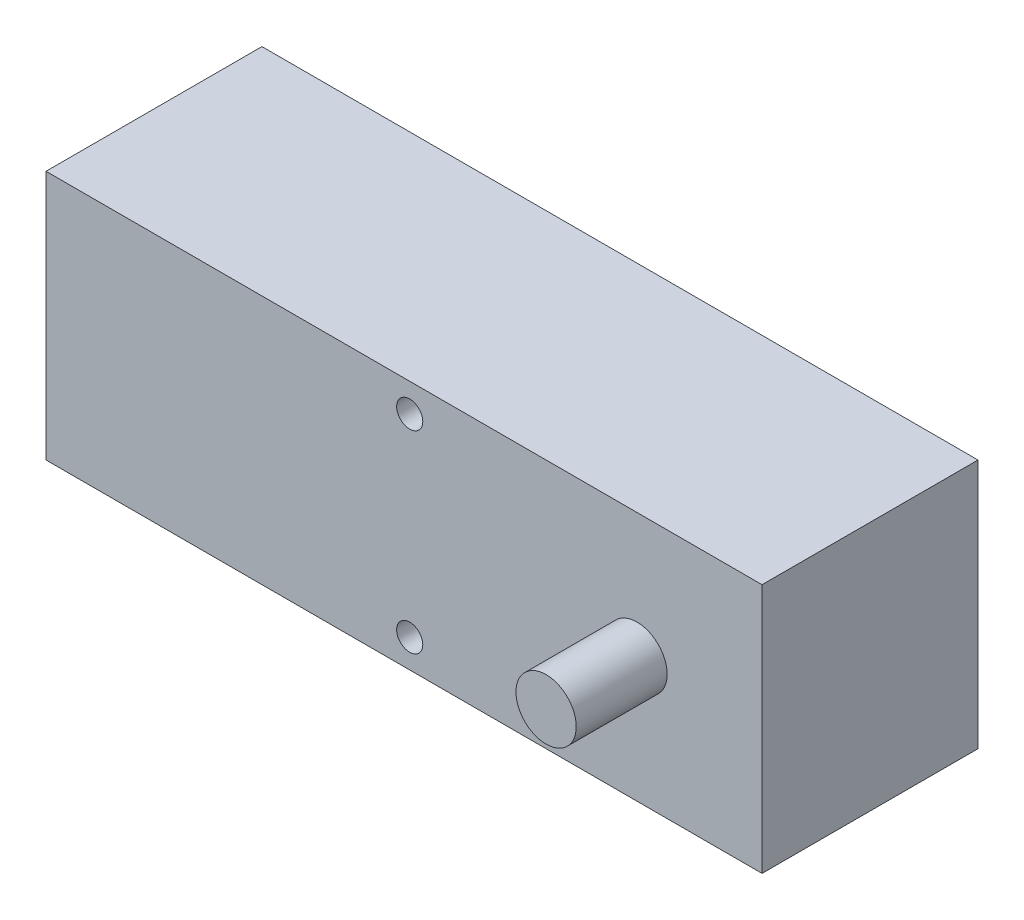
ISO-10303-21;
HEADER;
FILE_DESCRIPTION(('STEP AP214'),'2;1');
FILE_NAME('part.step','',(''),(''),'','','');
FILE_SCHEMA(('AUTOMOTIVE_DESIGN { 1 0 10303 214 1 1 1 1 }'));
ENDSEC;
DATA;
#1=APPLICATION_CONTEXT('core data for automotive mechanical design processes');
#2=APPLICATION_PROTOCOL_DEFINITION('international standard','automotive_design',2000,#1);
#3=PRODUCT_CONTEXT('',#1,'mechanical');
#4=PRODUCT('Part','Part','',(#3));
#5=PRODUCT_RELATED_PRODUCT_CATEGORY('part','',(#4));
#6=PRODUCT_DEFINITION_FORMATION('','',#4);
#7=PRODUCT_DEFINITION_CONTEXT('part definition',#1,'design');
#8=PRODUCT_DEFINITION('design','',#6,#7);
#9=PRODUCT_DEFINITION_SHAPE('','',#8);
#10=(LENGTH_UNIT() NAMED_UNIT(*) SI_UNIT(.MILLI.,.METRE.));
#11=(NAMED_UNIT(*) PLANE_ANGLE_UNIT() SI_UNIT($,.RADIAN.));
#12=(NAMED_UNIT(*) SI_UNIT($,.STERADIAN.) SOLID_ANGLE_UNIT());
#13=UNCERTAINTY_MEASURE_WITH_UNIT(LENGTH_MEASURE(1.E-05),#10,'distance_accuracy_value','');
#14=(GEOMETRIC_REPRESENTATION_CONTEXT(3) GLOBAL_UNCERTAINTY_ASSIGNED_CONTEXT((#13)) GLOBAL_UNIT_ASSIGNED_CONTEXT((#10,
#11,#12)) REPRESENTATION_CONTEXT('',''));
#15=CARTESIAN_POINT('',(0.,0.,0.));
#16=DIRECTION('',(0.,0.,1.));
#17=DIRECTION('',(1.,0.,0.));
#18=AXIS2_PLACEMENT_3D('',#15,#16,#17);
#19=CARTESIAN_POINT('',(0.,0.,19.));
#20=DIRECTION('',(0.,0.,-1.));
#21=DIRECTION('',(-1.,0.,0.));
#22=AXIS2_PLACEMENT_3D('',#19,#20,#21);
#23=PLANE('',#22);
#24=CARTESIAN_POINT('',(52.,11.,19.));
#25=DIRECTION('',(0.,0.,-1.));
#26=DIRECTION('',(-1.,0.,0.));
#27=AXIS2_PLACEMENT_3D('',#24,#25,#26);
#28=CIRCLE('',#27,2.65);
#29=CARTESIAN_POINT('',(49.35,11.,19.));
#30=VERTEX_POINT('',#29);
#31=EDGE_CURVE('E11',#30,#30,#28,.F.);
#32=ORIENTED_EDGE('',*,*,#31,.F.);
#33=EDGE_LOOP('',(#32));
#34=FACE_BOUND('',#33,.T.);
#35=DIRECTION('',(0.,-1.,0.));
#36=VECTOR('',#35,1.);
#37=CARTESIAN_POINT('',(0.,0.,19.));
#38=LINE('',#37,#36);
#39=CARTESIAN_POINT('',(0.,22.,19.));
#40=VERTEX_POINT('',#39);
#41=CARTESIAN_POINT('',(0.,0.,19.));
#42=VERTEX_POINT('',#41);
#43=EDGE_CURVE('E93',#40,#42,#38,.T.);
#44=ORIENTED_EDGE('',*,*,#43,.T.);
#45=DIRECTION('',(1.,0.,0.));
#46=VECTOR('',#45,1.);
#47=CARTESIAN_POINT('',(0.,0.,19.));
#48=LINE('',#47,#46);
#49=CARTESIAN_POINT('',(63.,0.,19.));
#50=VERTEX_POINT('',#49);
#51=EDGE_CURVE('E88',#42,#50,#48,.T.);
#52=ORIENTED_EDGE('',*,*,#51,.T.);
#53=DIRECTION('',(0.,1.,0.));
#54=VECTOR('',#53,1.);
#55=CARTESIAN_POINT('',(63.,0.,19.));
#56=LINE('',#55,#54);
#57=CARTESIAN_POINT('',(63.,22.,19.));
#58=VERTEX_POINT('',#57);
#59=EDGE_CURVE('E91',#50,#58,#56,.T.);
#60=ORIENTED_EDGE('',*,*,#59,.T.);
#61=DIRECTION('',(-1.,0.,0.));
#62=VECTOR('',#61,1.);
#63=CARTESIAN_POINT('',(0.,22.,19.));
#64=LINE('',#63,#62);
#65=EDGE_CURVE('E57',#58,#40,#64,.T.);
#66=ORIENTED_EDGE('',*,*,#65,.T.);
#67=EDGE_LOOP('',(#44,#52,#60,#66));
#68=FACE_BOUND('',#67,.T.);
#69=CARTESIAN_POINT('',(32.,19.5,19.));
#70=DIRECTION('',(0.,0.,1.));
#71=DIRECTION('',(1.,0.,0.));
#72=AXIS2_PLACEMENT_3D('',#69,#70,#71);
#73=CIRCLE('',#72,1.15);
#74=CARTESIAN_POINT('',(33.15,19.5,19.));
#75=VERTEX_POINT('',#74);
#76=EDGE_CURVE('E115',#75,#75,#73,.T.);
#77=ORIENTED_EDGE('',*,*,#76,.F.);
#78=EDGE_LOOP('',(#77));
#79=FACE_BOUND('',#78,.T.);
#80=CARTESIAN_POINT('',(32.,2.5,19.));
#81=DIRECTION('',(0.,0.,1.));
#82=DIRECTION('',(1.,0.,0.));
#83=AXIS2_PLACEMENT_3D('',#80,#81,#82);
#84=CIRCLE('',#83,1.15);
#85=CARTESIAN_POINT('',(33.15,2.5,19.));
#86=VERTEX_POINT('',#85);
#87=EDGE_CURVE('E139',#86,#86,#84,.T.);
#88=ORIENTED_EDGE('',*,*,#87,.F.);
#89=EDGE_LOOP('',(#88));
#90=FACE_BOUND('',#89,.T.);
#91=ADVANCED_FACE('F39',(#34,#68,#79,#90),#23,.F.);
#92=CARTESIAN_POINT('',(0.,0.,0.));
#93=DIRECTION('',(0.,0.,-1.));
#94=DIRECTION('',(-1.,0.,0.));
#95=AXIS2_PLACEMENT_3D('',#92,#93,#94);
#96=PLANE('',#95);
#97=CARTESIAN_POINT('',(32.,19.5,0.));
#98=DIRECTION('',(0.,0.,1.));
#99=DIRECTION('',(1.,0.,0.));
#100=AXIS2_PLACEMENT_3D('',#97,#98,#99);
#101=CIRCLE('',#100,1.15);
#102=CARTESIAN_POINT('',(33.15,19.5,0.));
#103=VERTEX_POINT('',#102);
#104=EDGE_CURVE('E145',#103,#103,#101,.T.);
#105=ORIENTED_EDGE('',*,*,#104,.T.);
#106=EDGE_LOOP('',(#105));
#107=FACE_BOUND('',#106,.T.);
#108=DIRECTION('',(0.,-1.,0.));
#109=VECTOR('',#108,1.);
#110=CARTESIAN_POINT('',(0.,0.,0.));
#111=LINE('',#110,#109);
#112=CARTESIAN_POINT('',(0.,22.,0.));
#113=VERTEX_POINT('',#112);
#114=CARTESIAN_POINT('',(0.,0.,0.));
#115=VERTEX_POINT('',#114);
#116=EDGE_CURVE('E111',#113,#115,#111,.T.);
#117=ORIENTED_EDGE('',*,*,#116,.F.);
#118=DIRECTION('',(-1.,0.,0.));
#119=VECTOR('',#118,1.);
#120=CARTESIAN_POINT('',(0.,22.,0.));
#121=LINE('',#120,#119);
#122=CARTESIAN_POINT('',(63.,22.,0.));
#123=VERTEX_POINT('',#122);
#124=EDGE_CURVE('E80',#123,#113,#121,.T.);
#125=ORIENTED_EDGE('',*,*,#124,.F.);
#126=DIRECTION('',(0.,1.,0.));
#127=VECTOR('',#126,1.);
#128=CARTESIAN_POINT('',(63.,0.,0.));
#129=LINE('',#128,#127);
#130=CARTESIAN_POINT('',(63.,0.,0.));
#131=VERTEX_POINT('',#130);
#132=EDGE_CURVE('E74',#131,#123,#129,.T.);
#133=ORIENTED_EDGE('',*,*,#132,.F.);
#134=DIRECTION('',(1.,0.,0.));
#135=VECTOR('',#134,1.);
#136=CARTESIAN_POINT('',(0.,0.,0.));
#137=LINE('',#136,#135);
#138=EDGE_CURVE('E99',#115,#131,#137,.T.);
#139=ORIENTED_EDGE('',*,*,#138,.F.);
#140=EDGE_LOOP('',(#117,#125,#133,#139));
#141=FACE_BOUND('',#140,.T.);
#142=CARTESIAN_POINT('',(32.,2.5,0.));
#143=DIRECTION('',(0.,0.,1.));
#144=DIRECTION('',(1.,0.,0.));
#145=AXIS2_PLACEMENT_3D('',#142,#143,#144);
#146=CIRCLE('',#145,1.15);
#147=CARTESIAN_POINT('',(33.15,2.5,0.));
#148=VERTEX_POINT('',#147);
#149=EDGE_CURVE('E136',#148,#148,#146,.T.);
#150=ORIENTED_EDGE('',*,*,#149,.T.);
#151=EDGE_LOOP('',(#150));
#152=FACE_BOUND('',#151,.T.);
#153=ADVANCED_FACE('F129',(#107,#141,#152),#96,.T.);
#154=CARTESIAN_POINT('',(0.,0.,19.));
#155=DIRECTION('',(1.,0.,0.));
#156=DIRECTION('',(0.,0.,-1.));
#157=AXIS2_PLACEMENT_3D('',#154,#155,#156);
#158=PLANE('',#157);
#159=ORIENTED_EDGE('',*,*,#116,.T.);
#160=DIRECTION('',(0.,0.,-1.));
#161=VECTOR('',#160,1.);
#162=CARTESIAN_POINT('',(0.,0.,19.));
#163=LINE('',#162,#161);
#164=EDGE_CURVE('E49',#42,#115,#163,.T.);
#165=ORIENTED_EDGE('',*,*,#164,.F.);
#166=ORIENTED_EDGE('',*,*,#43,.F.);
#167=DIRECTION('',(0.,0.,-1.));
#168=VECTOR('',#167,1.);
#169=CARTESIAN_POINT('',(0.,22.,19.));
#170=LINE('',#169,#168);
#171=EDGE_CURVE('E107',#40,#113,#170,.T.);
#172=ORIENTED_EDGE('',*,*,#171,.T.);
#173=EDGE_LOOP('',(#159,#165,#166,#172));
#174=FACE_BOUND('',#173,.T.);
#175=ADVANCED_FACE('F41',(#174),#158,.F.);
#176=CARTESIAN_POINT('',(0.,0.,19.));
#177=DIRECTION('',(0.,1.,0.));
#178=DIRECTION('',(0.,0.,1.));
#179=AXIS2_PLACEMENT_3D('',#176,#177,#178);
#180=PLANE('',#179);
#181=ORIENTED_EDGE('',*,*,#138,.T.);
#182=DIRECTION('',(0.,0.,-1.));
#183=VECTOR('',#182,1.);
#184=CARTESIAN_POINT('',(63.,0.,19.));
#185=LINE('',#184,#183);
#186=EDGE_CURVE('E97',#50,#131,#185,.T.);
#187=ORIENTED_EDGE('',*,*,#186,.F.);
#188=ORIENTED_EDGE('',*,*,#51,.F.);
#189=ORIENTED_EDGE('',*,*,#164,.T.);
#190=EDGE_LOOP('',(#181,#187,#188,#189));
#191=FACE_BOUND('',#190,.T.);
#192=ADVANCED_FACE('F98',(#191),#180,.F.);
#193=CARTESIAN_POINT('',(63.,0.,19.));
#194=DIRECTION('',(-1.,0.,0.));
#195=DIRECTION('',(0.,0.,1.));
#196=AXIS2_PLACEMENT_3D('',#193,#194,#195);
#197=PLANE('',#196);
#198=ORIENTED_EDGE('',*,*,#132,.T.);
#199=DIRECTION('',(0.,0.,-1.));
#200=VECTOR('',#199,1.);
#201=CARTESIAN_POINT('',(63.,22.,19.));
#202=LINE('',#201,#200);
#203=EDGE_CURVE('E101',#58,#123,#202,.T.);
#204=ORIENTED_EDGE('',*,*,#203,.F.);
#205=ORIENTED_EDGE('',*,*,#59,.F.);
#206=ORIENTED_EDGE('',*,*,#186,.T.);
#207=EDGE_LOOP('',(#198,#204,#205,#206));
#208=FACE_BOUND('',#207,.T.);
#209=ADVANCED_FACE('F103',(#208),#197,.F.);
#210=CARTESIAN_POINT('',(0.,22.,19.));
#211=DIRECTION('',(0.,-1.,0.));
#212=DIRECTION('',(0.,0.,-1.));
#213=AXIS2_PLACEMENT_3D('',#210,#211,#212);
#214=PLANE('',#213);
#215=ORIENTED_EDGE('',*,*,#124,.T.);
#216=ORIENTED_EDGE('',*,*,#171,.F.);
#217=ORIENTED_EDGE('',*,*,#65,.F.);
#218=ORIENTED_EDGE('',*,*,#203,.T.);
#219=EDGE_LOOP('',(#215,#216,#217,#218));
#220=FACE_BOUND('',#219,.T.);
#221=ADVANCED_FACE('F161',(#220),#214,.F.);
#222=CARTESIAN_POINT('',(32.,19.5,19.));
#223=DIRECTION('',(0.,0.,-1.));
#224=DIRECTION('',(-1.,0.,0.));
#225=AXIS2_PLACEMENT_3D('',#222,#223,#224);
#226=CYLINDRICAL_SURFACE('',#225,1.15);
#227=ORIENTED_EDGE('',*,*,#76,.T.);
#228=EDGE_LOOP('',(#227));
#229=FACE_BOUND('',#228,.T.);
#230=ORIENTED_EDGE('',*,*,#104,.F.);
#231=EDGE_LOOP('',(#230));
#232=FACE_BOUND('',#231,.T.);
#233=ADVANCED_FACE('F158',(#229,#232),#226,.F.);
#234=CARTESIAN_POINT('',(32.,2.5,19.));
#235=DIRECTION('',(0.,0.,-1.));
#236=DIRECTION('',(-1.,0.,0.));
#237=AXIS2_PLACEMENT_3D('',#234,#235,#236);
#238=CYLINDRICAL_SURFACE('',#237,1.15);
#239=ORIENTED_EDGE('',*,*,#87,.T.);
#240=EDGE_LOOP('',(#239));
#241=FACE_BOUND('',#240,.T.);
#242=ORIENTED_EDGE('',*,*,#149,.F.);
#243=EDGE_LOOP('',(#242));
#244=FACE_BOUND('',#243,.T.);
#245=ADVANCED_FACE('F160',(#241,#244),#238,.F.);
#246=CARTESIAN_POINT('',(52.,11.,27.));
#247=DIRECTION('',(0.,0.,-1.));
#248=DIRECTION('',(-1.,0.,0.));
#249=AXIS2_PLACEMENT_3D('',#246,#247,#248);
#250=CYLINDRICAL_SURFACE('',#249,2.65);
#251=CARTESIAN_POINT('',(52.,11.,27.));
#252=DIRECTION('',(0.,0.,1.));
#253=DIRECTION('',(1.,0.,0.));
#254=AXIS2_PLACEMENT_3D('',#251,#252,#253);
#255=CIRCLE('',#254,2.65);
#256=CARTESIAN_POINT('',(54.65,11.,27.));
#257=VERTEX_POINT('',#256);
#258=EDGE_CURVE('E140',#257,#257,#255,.T.);
#259=ORIENTED_EDGE('',*,*,#258,.F.);
#260=EDGE_LOOP('',(#259));
#261=FACE_BOUND('',#260,.T.);
#262=ORIENTED_EDGE('',*,*,#31,.T.);
#263=EDGE_LOOP('',(#262));
#264=FACE_BOUND('',#263,.T.);
#265=ADVANCED_FACE('F168',(#261,#264),#250,.T.);
#266=CARTESIAN_POINT('',(52.,11.,27.));
#267=DIRECTION('',(0.,0.,1.));
#268=DIRECTION('',(1.,0.,0.));
#269=AXIS2_PLACEMENT_3D('',#266,#267,#268);
#270=PLANE('',#269);
#271=ORIENTED_EDGE('',*,*,#258,.T.);
#272=EDGE_LOOP('',(#271));
#273=FACE_BOUND('',#272,.T.);
#274=ADVANCED_FACE('F228',(#273),#270,.T.);
#275=CLOSED_SHELL('',(#91,#153,#175,#192,#209,#221,#233,#245,#265,#274));
#276=MANIFOLD_SOLID_BREP('B2',#275);
#277=ADVANCED_BREP_SHAPE_REPRESENTATION('',(#18,#276),#14);
#278=SHAPE_DEFINITION_REPRESENTATION(#9,#277);
ENDSEC;
END-ISO-10303-21;
